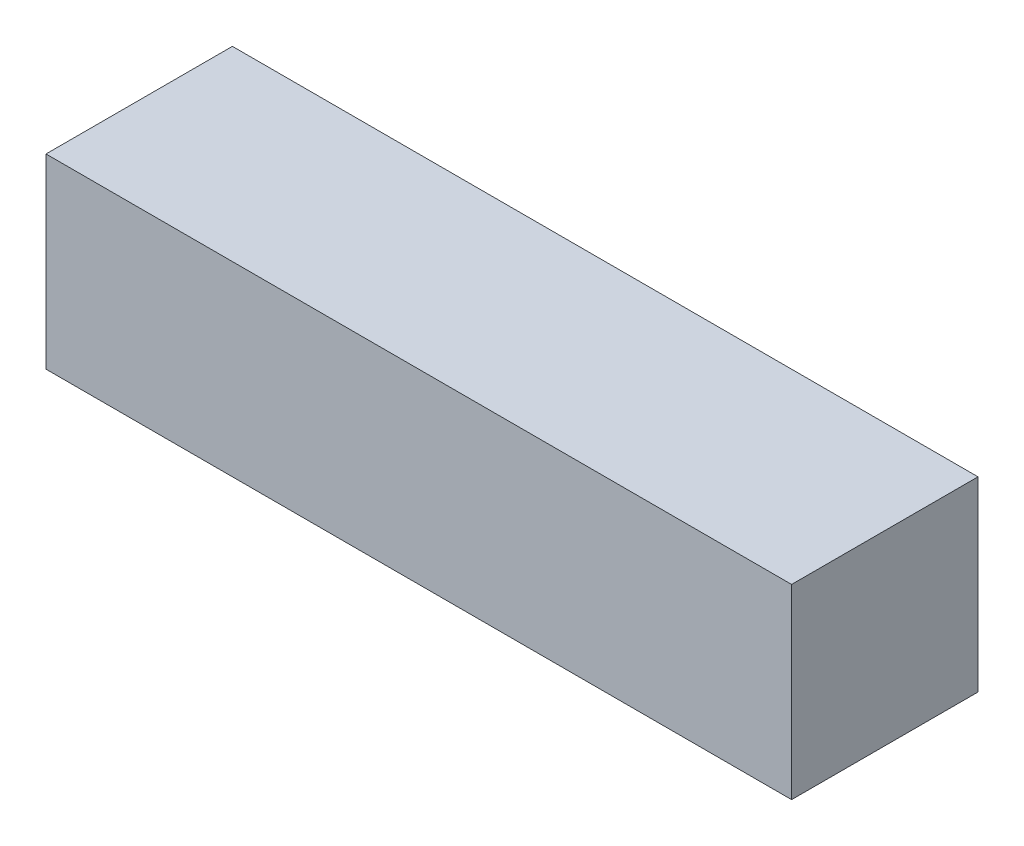
ISO-10303-21;
HEADER;
FILE_DESCRIPTION(('STEP AP214'),'2;1');
FILE_NAME('part.step','',(''),(''),'','','');
FILE_SCHEMA(('AUTOMOTIVE_DESIGN { 1 0 10303 214 1 1 1 1 }'));
ENDSEC;
DATA;
#1=APPLICATION_CONTEXT('core data for automotive mechanical design processes');
#2=APPLICATION_PROTOCOL_DEFINITION('international standard','automotive_design',2000,#1);
#3=PRODUCT_CONTEXT('',#1,'mechanical');
#4=PRODUCT('Part','Part','',(#3));
#5=PRODUCT_RELATED_PRODUCT_CATEGORY('part','',(#4));
#6=PRODUCT_DEFINITION_FORMATION('','',#4);
#7=PRODUCT_DEFINITION_CONTEXT('part definition',#1,'design');
#8=PRODUCT_DEFINITION('design','',#6,#7);
#9=PRODUCT_DEFINITION_SHAPE('','',#8);
#10=(LENGTH_UNIT() NAMED_UNIT(*) SI_UNIT(.MILLI.,.METRE.));
#11=(NAMED_UNIT(*) PLANE_ANGLE_UNIT() SI_UNIT($,.RADIAN.));
#12=(NAMED_UNIT(*) SI_UNIT($,.STERADIAN.) SOLID_ANGLE_UNIT());
#13=UNCERTAINTY_MEASURE_WITH_UNIT(LENGTH_MEASURE(1.E-05),#10,'distance_accuracy_value','');
#14=(GEOMETRIC_REPRESENTATION_CONTEXT(3) GLOBAL_UNCERTAINTY_ASSIGNED_CONTEXT((#13)) GLOBAL_UNIT_ASSIGNED_CONTEXT((#10,
#11,#12)) REPRESENTATION_CONTEXT('',''));
#15=CARTESIAN_POINT('',(0.,0.,0.));
#16=DIRECTION('',(0.,0.,1.));
#17=DIRECTION('',(1.,0.,0.));
#18=AXIS2_PLACEMENT_3D('',#15,#16,#17);
#19=CARTESIAN_POINT('',(10.16,0.,0.));
#20=DIRECTION('',(0.,0.,-1.));
#21=DIRECTION('',(-1.,0.,0.));
#22=AXIS2_PLACEMENT_3D('',#19,#20,#21);
#23=PLANE('',#22);
#24=DIRECTION('',(0.,-1.,0.));
#25=VECTOR('',#24,1.);
#26=CARTESIAN_POINT('',(0.,0.,0.));
#27=LINE('',#26,#25);
#28=CARTESIAN_POINT('',(0.,2.54,0.));
#29=VERTEX_POINT('',#28);
#30=CARTESIAN_POINT('',(0.,0.,0.));
#31=VERTEX_POINT('',#30);
#32=EDGE_CURVE('E96',#29,#31,#27,.T.);
#33=ORIENTED_EDGE('',*,*,#32,.T.);
#34=DIRECTION('',(-1.,0.,0.));
#35=VECTOR('',#34,1.);
#36=CARTESIAN_POINT('',(10.16,0.,0.));
#37=LINE('',#36,#35);
#38=CARTESIAN_POINT('',(10.16,0.,0.));
#39=VERTEX_POINT('',#38);
#40=EDGE_CURVE('E11',#39,#31,#37,.T.);
#41=ORIENTED_EDGE('',*,*,#40,.F.);
#42=DIRECTION('',(0.,-1.,0.));
#43=VECTOR('',#42,1.);
#44=CARTESIAN_POINT('',(10.16,0.,0.));
#45=LINE('',#44,#43);
#46=CARTESIAN_POINT('',(10.16,2.54,0.));
#47=VERTEX_POINT('',#46);
#48=EDGE_CURVE('E84',#47,#39,#45,.T.);
#49=ORIENTED_EDGE('',*,*,#48,.F.);
#50=DIRECTION('',(-1.,0.,0.));
#51=VECTOR('',#50,1.);
#52=CARTESIAN_POINT('',(10.16,2.54,0.));
#53=LINE('',#52,#51);
#54=EDGE_CURVE('E92',#47,#29,#53,.T.);
#55=ORIENTED_EDGE('',*,*,#54,.T.);
#56=EDGE_LOOP('',(#33,#41,#49,#55));
#57=FACE_BOUND('',#56,.T.);
#58=ADVANCED_FACE('F33',(#57),#23,.F.);
#59=CARTESIAN_POINT('',(10.16,0.,0.));
#60=DIRECTION('',(0.,1.,0.));
#61=DIRECTION('',(0.,0.,1.));
#62=AXIS2_PLACEMENT_3D('',#59,#60,#61);
#63=PLANE('',#62);
#64=DIRECTION('',(0.,0.,-1.));
#65=VECTOR('',#64,1.);
#66=CARTESIAN_POINT('',(0.,0.,0.));
#67=LINE('',#66,#65);
#68=CARTESIAN_POINT('',(0.,0.,-2.54));
#69=VERTEX_POINT('',#68);
#70=EDGE_CURVE('E88',#31,#69,#67,.T.);
#71=ORIENTED_EDGE('',*,*,#70,.T.);
#72=DIRECTION('',(-1.,0.,0.));
#73=VECTOR('',#72,1.);
#74=CARTESIAN_POINT('',(10.16,0.,-2.54));
#75=LINE('',#74,#73);
#76=CARTESIAN_POINT('',(10.16,0.,-2.54));
#77=VERTEX_POINT('',#76);
#78=EDGE_CURVE('E41',#77,#69,#75,.T.);
#79=ORIENTED_EDGE('',*,*,#78,.F.);
#80=DIRECTION('',(0.,0.,-1.));
#81=VECTOR('',#80,1.);
#82=CARTESIAN_POINT('',(10.16,0.,0.));
#83=LINE('',#82,#81);
#84=EDGE_CURVE('E79',#39,#77,#83,.T.);
#85=ORIENTED_EDGE('',*,*,#84,.F.);
#86=ORIENTED_EDGE('',*,*,#40,.T.);
#87=EDGE_LOOP('',(#71,#79,#85,#86));
#88=FACE_BOUND('',#87,.T.);
#89=ADVANCED_FACE('F87',(#88),#63,.F.);
#90=CARTESIAN_POINT('',(10.16,0.,-2.54));
#91=DIRECTION('',(0.,0.,1.));
#92=DIRECTION('',(1.,0.,0.));
#93=AXIS2_PLACEMENT_3D('',#90,#91,#92);
#94=PLANE('',#93);
#95=DIRECTION('',(0.,1.,0.));
#96=VECTOR('',#95,1.);
#97=CARTESIAN_POINT('',(0.,0.,-2.54));
#98=LINE('',#97,#96);
#99=CARTESIAN_POINT('',(0.,2.54,-2.54));
#100=VERTEX_POINT('',#99);
#101=EDGE_CURVE('E66',#69,#100,#98,.T.);
#102=ORIENTED_EDGE('',*,*,#101,.T.);
#103=DIRECTION('',(-1.,0.,0.));
#104=VECTOR('',#103,1.);
#105=CARTESIAN_POINT('',(10.16,2.54,-2.54));
#106=LINE('',#105,#104);
#107=CARTESIAN_POINT('',(10.16,2.54,-2.54));
#108=VERTEX_POINT('',#107);
#109=EDGE_CURVE('E89',#108,#100,#106,.T.);
#110=ORIENTED_EDGE('',*,*,#109,.F.);
#111=DIRECTION('',(0.,1.,0.));
#112=VECTOR('',#111,1.);
#113=CARTESIAN_POINT('',(10.16,0.,-2.54));
#114=LINE('',#113,#112);
#115=EDGE_CURVE('E82',#77,#108,#114,.T.);
#116=ORIENTED_EDGE('',*,*,#115,.F.);
#117=ORIENTED_EDGE('',*,*,#78,.T.);
#118=EDGE_LOOP('',(#102,#110,#116,#117));
#119=FACE_BOUND('',#118,.T.);
#120=ADVANCED_FACE('F90',(#119),#94,.F.);
#121=CARTESIAN_POINT('',(10.16,2.54,0.));
#122=DIRECTION('',(0.,-1.,0.));
#123=DIRECTION('',(0.,0.,-1.));
#124=AXIS2_PLACEMENT_3D('',#121,#122,#123);
#125=PLANE('',#124);
#126=DIRECTION('',(0.,0.,1.));
#127=VECTOR('',#126,1.);
#128=CARTESIAN_POINT('',(0.,2.54,0.));
#129=LINE('',#128,#127);
#130=EDGE_CURVE('E72',#100,#29,#129,.T.);
#131=ORIENTED_EDGE('',*,*,#130,.T.);
#132=ORIENTED_EDGE('',*,*,#54,.F.);
#133=DIRECTION('',(0.,0.,1.));
#134=VECTOR('',#133,1.);
#135=CARTESIAN_POINT('',(10.16,2.54,0.));
#136=LINE('',#135,#134);
#137=EDGE_CURVE('E49',#108,#47,#136,.T.);
#138=ORIENTED_EDGE('',*,*,#137,.F.);
#139=ORIENTED_EDGE('',*,*,#109,.T.);
#140=EDGE_LOOP('',(#131,#132,#138,#139));
#141=FACE_BOUND('',#140,.T.);
#142=ADVANCED_FACE('F103',(#141),#125,.F.);
#143=CARTESIAN_POINT('',(10.16,0.,0.));
#144=DIRECTION('',(-1.,0.,0.));
#145=DIRECTION('',(0.,0.,1.));
#146=AXIS2_PLACEMENT_3D('',#143,#144,#145);
#147=PLANE('',#146);
#148=ORIENTED_EDGE('',*,*,#48,.T.);
#149=ORIENTED_EDGE('',*,*,#84,.T.);
#150=ORIENTED_EDGE('',*,*,#115,.T.);
#151=ORIENTED_EDGE('',*,*,#137,.T.);
#152=EDGE_LOOP('',(#148,#149,#150,#151));
#153=FACE_BOUND('',#152,.T.);
#154=ADVANCED_FACE('F80',(#153),#147,.F.);
#155=CARTESIAN_POINT('',(0.,0.,0.));
#156=DIRECTION('',(-1.,0.,0.));
#157=DIRECTION('',(0.,0.,1.));
#158=AXIS2_PLACEMENT_3D('',#155,#156,#157);
#159=PLANE('',#158);
#160=ORIENTED_EDGE('',*,*,#32,.F.);
#161=ORIENTED_EDGE('',*,*,#130,.F.);
#162=ORIENTED_EDGE('',*,*,#101,.F.);
#163=ORIENTED_EDGE('',*,*,#70,.F.);
#164=EDGE_LOOP('',(#160,#161,#162,#163));
#165=FACE_BOUND('',#164,.T.);
#166=ADVANCED_FACE('F106',(#165),#159,.T.);
#167=CLOSED_SHELL('',(#58,#89,#120,#142,#154,#166));
#168=MANIFOLD_SOLID_BREP('B2',#167);
#169=ADVANCED_BREP_SHAPE_REPRESENTATION('',(#18,#168),#14);
#170=SHAPE_DEFINITION_REPRESENTATION(#9,#169);
ENDSEC;
END-ISO-10303-21;
